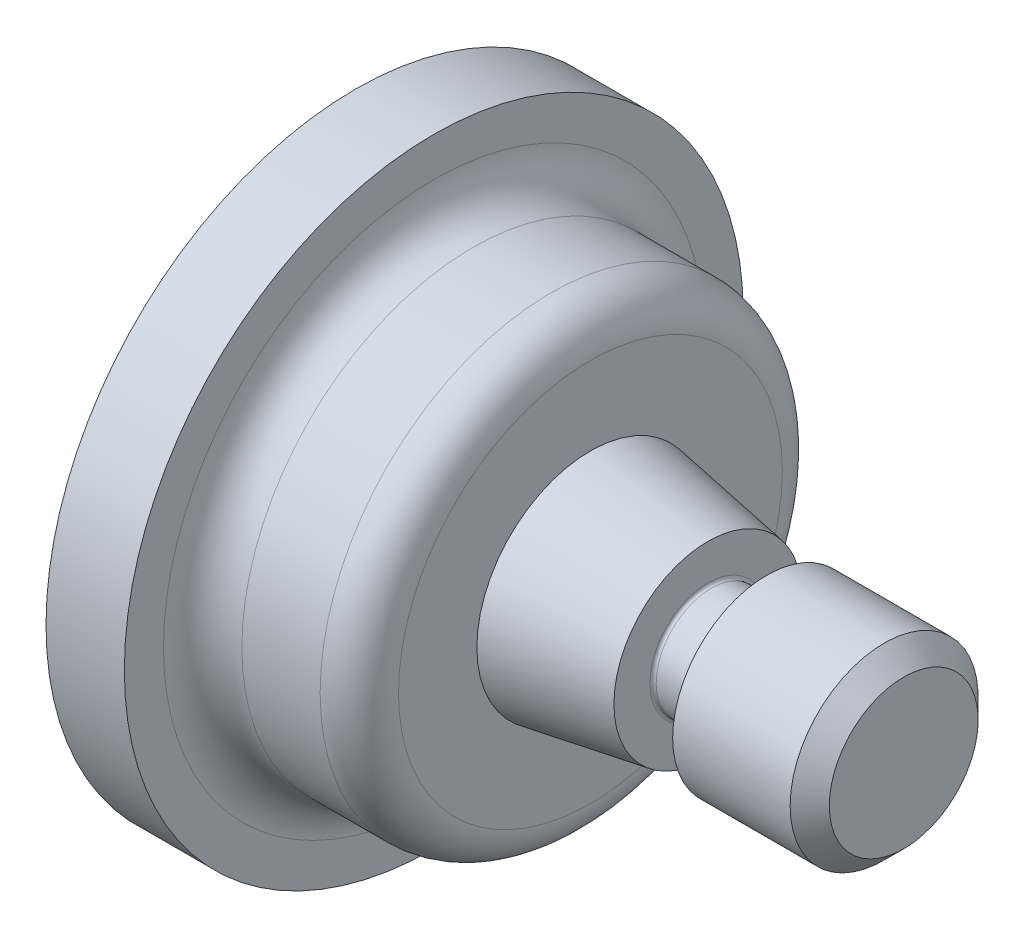
ISO-10303-21;
HEADER;
FILE_DESCRIPTION(('STEP AP214'),'2;1');
FILE_NAME('part.step','',(''),(''),'','','');
FILE_SCHEMA(('AUTOMOTIVE_DESIGN { 1 0 10303 214 1 1 1 1 }'));
ENDSEC;
DATA;
#1=APPLICATION_CONTEXT('core data for automotive mechanical design processes');
#2=APPLICATION_PROTOCOL_DEFINITION('international standard','automotive_design',2000,#1);
#3=PRODUCT_CONTEXT('',#1,'mechanical');
#4=PRODUCT('Part','Part','',(#3));
#5=PRODUCT_RELATED_PRODUCT_CATEGORY('part','',(#4));
#6=PRODUCT_DEFINITION_FORMATION('','',#4);
#7=PRODUCT_DEFINITION_CONTEXT('part definition',#1,'design');
#8=PRODUCT_DEFINITION('design','',#6,#7);
#9=PRODUCT_DEFINITION_SHAPE('','',#8);
#10=(LENGTH_UNIT() NAMED_UNIT(*) SI_UNIT(.MILLI.,.METRE.));
#11=(NAMED_UNIT(*) PLANE_ANGLE_UNIT() SI_UNIT($,.RADIAN.));
#12=(NAMED_UNIT(*) SI_UNIT($,.STERADIAN.) SOLID_ANGLE_UNIT());
#13=UNCERTAINTY_MEASURE_WITH_UNIT(LENGTH_MEASURE(1.E-05),#10,'distance_accuracy_value','');
#14=(GEOMETRIC_REPRESENTATION_CONTEXT(3) GLOBAL_UNCERTAINTY_ASSIGNED_CONTEXT((#13)) GLOBAL_UNIT_ASSIGNED_CONTEXT((#10,
#11,#12)) REPRESENTATION_CONTEXT('',''));
#15=CARTESIAN_POINT('',(0.,0.,0.));
#16=DIRECTION('',(0.,0.,1.));
#17=DIRECTION('',(1.,0.,0.));
#18=AXIS2_PLACEMENT_3D('',#15,#16,#17);
#19=CARTESIAN_POINT('',(-88.8999841855403,50.165,0.));
#20=DIRECTION('',(1.,0.,0.));
#21=DIRECTION('',(0.,0.,-1.));
#22=AXIS2_PLACEMENT_3D('',#19,#20,#21);
#23=PLANE('',#22);
#24=CARTESIAN_POINT('',(-88.8999841855403,0.,0.));
#25=DIRECTION('',(-1.,0.,0.));
#26=DIRECTION('',(0.,0.,1.));
#27=AXIS2_PLACEMENT_3D('',#24,#25,#26);
#28=CIRCLE('',#27,50.165);
#29=CARTESIAN_POINT('',(-88.8999841855403,0.,50.165));
#30=VERTEX_POINT('',#29);
#31=EDGE_CURVE('E83',#30,#30,#28,.T.);
#32=ORIENTED_EDGE('',*,*,#31,.T.);
#33=EDGE_LOOP('',(#32));
#34=FACE_BOUND('',#33,.T.);
#35=ADVANCED_FACE('F34',(#34),#23,.F.);
#36=CARTESIAN_POINT('',(0.,0.,0.));
#37=DIRECTION('',(-1.,0.,0.));
#38=DIRECTION('',(0.,0.,1.));
#39=AXIS2_PLACEMENT_3D('',#36,#37,#38);
#40=PLANE('',#39);
#41=CARTESIAN_POINT('',(0.,0.,0.));
#42=DIRECTION('',(-1.,0.,0.));
#43=DIRECTION('',(0.,0.,1.));
#44=AXIS2_PLACEMENT_3D('',#41,#42,#43);
#45=CIRCLE('',#44,12.0649920927663);
#46=CARTESIAN_POINT('',(0.,0.,12.0649920927663));
#47=VERTEX_POINT('',#46);
#48=EDGE_CURVE('E10',#47,#47,#45,.T.);
#49=ORIENTED_EDGE('',*,*,#48,.F.);
#50=EDGE_LOOP('',(#49));
#51=FACE_BOUND('',#50,.T.);
#52=ADVANCED_FACE('F167',(#51),#40,.F.);
#53=CARTESIAN_POINT('',(0.,0.,0.));
#54=DIRECTION('',(-1.,0.,0.));
#55=DIRECTION('',(0.,0.,1.));
#56=AXIS2_PLACEMENT_3D('',#53,#54,#55);
#57=CONICAL_SURFACE('',#56,12.0649920927663,0.785398163397448);
#58=CARTESIAN_POINT('',(-3.17500000000012,0.,0.));
#59=DIRECTION('',(-1.,0.,0.));
#60=DIRECTION('',(0.,0.,1.));
#61=AXIS2_PLACEMENT_3D('',#58,#59,#60);
#62=CIRCLE('',#61,15.2399920927665);
#63=CARTESIAN_POINT('',(-3.17500000000012,0.,15.2399920927665));
#64=VERTEX_POINT('',#63);
#65=EDGE_CURVE('E40',#64,#64,#62,.T.);
#66=ORIENTED_EDGE('',*,*,#65,.F.);
#67=EDGE_LOOP('',(#66));
#68=FACE_BOUND('',#67,.T.);
#69=ORIENTED_EDGE('',*,*,#48,.T.);
#70=EDGE_LOOP('',(#69));
#71=FACE_BOUND('',#70,.T.);
#72=ADVANCED_FACE('F162',(#68,#71),#57,.T.);
#73=CARTESIAN_POINT('',(0.,0.,0.));
#74=DIRECTION('',(-1.,0.,0.));
#75=DIRECTION('',(0.,0.,1.));
#76=AXIS2_PLACEMENT_3D('',#73,#74,#75);
#77=CYLINDRICAL_SURFACE('',#76,15.2399920927665);
#78=CARTESIAN_POINT('',(-22.2250000000001,0.,0.));
#79=DIRECTION('',(-1.,0.,0.));
#80=DIRECTION('',(0.,0.,1.));
#81=AXIS2_PLACEMENT_3D('',#78,#79,#80);
#82=CIRCLE('',#81,15.2399920927665);
#83=CARTESIAN_POINT('',(-22.2250000000001,0.,15.2399920927665));
#84=VERTEX_POINT('',#83);
#85=EDGE_CURVE('E44',#84,#84,#82,.T.);
#86=ORIENTED_EDGE('',*,*,#85,.F.);
#87=EDGE_LOOP('',(#86));
#88=FACE_BOUND('',#87,.T.);
#89=ORIENTED_EDGE('',*,*,#65,.T.);
#90=EDGE_LOOP('',(#89));
#91=FACE_BOUND('',#90,.T.);
#92=ADVANCED_FACE('F157',(#88,#91),#77,.T.);
#93=CARTESIAN_POINT('',(-22.2250000000001,15.2399920927665,0.));
#94=DIRECTION('',(1.,0.,0.));
#95=DIRECTION('',(0.,0.,-1.));
#96=AXIS2_PLACEMENT_3D('',#93,#94,#95);
#97=PLANE('',#96);
#98=CARTESIAN_POINT('',(-22.2250000000001,0.,0.));
#99=DIRECTION('',(-1.,0.,0.));
#100=DIRECTION('',(0.,0.,1.));
#101=AXIS2_PLACEMENT_3D('',#98,#99,#100);
#102=CIRCLE('',#101,9.39799209276645);
#103=CARTESIAN_POINT('',(-22.2250000000001,0.,9.39799209276645));
#104=VERTEX_POINT('',#103);
#105=EDGE_CURVE('E48',#104,#104,#102,.T.);
#106=ORIENTED_EDGE('',*,*,#105,.F.);
#107=EDGE_LOOP('',(#106));
#108=FACE_BOUND('',#107,.T.);
#109=ORIENTED_EDGE('',*,*,#85,.T.);
#110=EDGE_LOOP('',(#109));
#111=FACE_BOUND('',#110,.T.);
#112=ADVANCED_FACE('F151',(#108,#111),#97,.F.);
#113=CARTESIAN_POINT('',(-22.7330000000001,0.,0.));
#114=DIRECTION('',(-1.,0.,0.));
#115=DIRECTION('',(0.,0.,1.));
#116=AXIS2_PLACEMENT_3D('',#113,#114,#115);
#117=TOROIDAL_SURFACE('',#116,9.39799209276645,0.508000000000002);
#118=CARTESIAN_POINT('',(-22.7330000000001,0.,0.));
#119=DIRECTION('',(-1.,0.,0.));
#120=DIRECTION('',(0.,0.,1.));
#121=AXIS2_PLACEMENT_3D('',#118,#119,#120);
#122=CIRCLE('',#121,8.88999209276645);
#123=CARTESIAN_POINT('',(-22.7330000000001,0.,8.88999209276645));
#124=VERTEX_POINT('',#123);
#125=EDGE_CURVE('E53',#124,#124,#122,.T.);
#126=ORIENTED_EDGE('',*,*,#125,.F.);
#127=EDGE_LOOP('',(#126));
#128=FACE_BOUND('',#127,.T.);
#129=ORIENTED_EDGE('',*,*,#105,.T.);
#130=EDGE_LOOP('',(#129));
#131=FACE_BOUND('',#130,.T.);
#132=ADVANCED_FACE('F145',(#128,#131),#117,.F.);
#133=CARTESIAN_POINT('',(0.,0.,0.));
#134=DIRECTION('',(-1.,0.,0.));
#135=DIRECTION('',(0.,0.,1.));
#136=AXIS2_PLACEMENT_3D('',#133,#134,#135);
#137=CYLINDRICAL_SURFACE('',#136,8.88999209276645);
#138=CARTESIAN_POINT('',(-31.2420000000001,0.,0.));
#139=DIRECTION('',(-1.,0.,0.));
#140=DIRECTION('',(0.,0.,1.));
#141=AXIS2_PLACEMENT_3D('',#138,#139,#140);
#142=CIRCLE('',#141,8.88999209276646);
#143=CARTESIAN_POINT('',(-31.2420000000001,0.,8.88999209276646));
#144=VERTEX_POINT('',#143);
#145=EDGE_CURVE('E56',#144,#144,#142,.T.);
#146=ORIENTED_EDGE('',*,*,#145,.F.);
#147=EDGE_LOOP('',(#146));
#148=FACE_BOUND('',#147,.T.);
#149=ORIENTED_EDGE('',*,*,#125,.T.);
#150=EDGE_LOOP('',(#149));
#151=FACE_BOUND('',#150,.T.);
#152=ADVANCED_FACE('F139',(#148,#151),#137,.T.);
#153=CARTESIAN_POINT('',(-31.2420000000001,0.,0.));
#154=DIRECTION('',(-1.,0.,0.));
#155=DIRECTION('',(0.,0.,1.));
#156=AXIS2_PLACEMENT_3D('',#153,#154,#155);
#157=TOROIDAL_SURFACE('',#156,9.39799209276645,0.508);
#158=CARTESIAN_POINT('',(-31.7500000000001,0.,0.));
#159=DIRECTION('',(-1.,0.,0.));
#160=DIRECTION('',(0.,0.,1.));
#161=AXIS2_PLACEMENT_3D('',#158,#159,#160);
#162=CIRCLE('',#161,9.39799209276645);
#163=CARTESIAN_POINT('',(-31.7500000000001,0.,9.39799209276645));
#164=VERTEX_POINT('',#163);
#165=EDGE_CURVE('E59',#164,#164,#162,.T.);
#166=ORIENTED_EDGE('',*,*,#165,.F.);
#167=EDGE_LOOP('',(#166));
#168=FACE_BOUND('',#167,.T.);
#169=ORIENTED_EDGE('',*,*,#145,.T.);
#170=EDGE_LOOP('',(#169));
#171=FACE_BOUND('',#170,.T.);
#172=ADVANCED_FACE('F133',(#168,#171),#157,.F.);
#173=CARTESIAN_POINT('',(-31.7500000000001,15.2399920927665,0.));
#174=DIRECTION('',(-1.,0.,0.));
#175=DIRECTION('',(0.,0.,1.));
#176=AXIS2_PLACEMENT_3D('',#173,#174,#175);
#177=PLANE('',#176);
#178=CARTESIAN_POINT('',(-31.7500000000001,0.,0.));
#179=DIRECTION('',(-1.,0.,0.));
#180=DIRECTION('',(0.,0.,1.));
#181=AXIS2_PLACEMENT_3D('',#178,#179,#180);
#182=CIRCLE('',#181,15.2399920927665);
#183=CARTESIAN_POINT('',(-31.7500000000001,0.,15.2399920927665));
#184=VERTEX_POINT('',#183);
#185=EDGE_CURVE('E62',#184,#184,#182,.T.);
#186=ORIENTED_EDGE('',*,*,#185,.F.);
#187=EDGE_LOOP('',(#186));
#188=FACE_BOUND('',#187,.T.);
#189=ORIENTED_EDGE('',*,*,#165,.T.);
#190=EDGE_LOOP('',(#189));
#191=FACE_BOUND('',#190,.T.);
#192=ADVANCED_FACE('F127',(#188,#191),#177,.F.);
#193=CARTESIAN_POINT('',(-31.7500000000001,0.,0.));
#194=DIRECTION('',(-1.,0.,0.));
#195=DIRECTION('',(0.,0.,1.));
#196=AXIS2_PLACEMENT_3D('',#193,#194,#195);
#197=CONICAL_SURFACE('',#196,15.2399920927665,0.165148677414627);
#198=CARTESIAN_POINT('',(-50.7987547671477,0.,0.));
#199=DIRECTION('',(-1.,0.,0.));
#200=DIRECTION('',(0.,0.,1.));
#201=AXIS2_PLACEMENT_3D('',#198,#199,#200);
#202=CIRCLE('',#201,18.4147845539577);
#203=CARTESIAN_POINT('',(-50.7987547671477,0.,18.4147845539577));
#204=VERTEX_POINT('',#203);
#205=EDGE_CURVE('E65',#204,#204,#202,.T.);
#206=ORIENTED_EDGE('',*,*,#205,.F.);
#207=EDGE_LOOP('',(#206));
#208=FACE_BOUND('',#207,.T.);
#209=ORIENTED_EDGE('',*,*,#185,.T.);
#210=EDGE_LOOP('',(#209));
#211=FACE_BOUND('',#210,.T.);
#212=ADVANCED_FACE('F121',(#208,#211),#197,.T.);
#213=CARTESIAN_POINT('',(-50.7987547671477,31.1149920927665,0.));
#214=DIRECTION('',(-1.,0.,0.));
#215=DIRECTION('',(0.,0.,1.));
#216=AXIS2_PLACEMENT_3D('',#213,#214,#215);
#217=PLANE('',#216);
#218=CARTESIAN_POINT('',(-50.7987547671477,0.,0.));
#219=DIRECTION('',(-1.,0.,0.));
#220=DIRECTION('',(0.,0.,1.));
#221=AXIS2_PLACEMENT_3D('',#218,#219,#220);
#222=CIRCLE('',#221,31.1149920927665);
#223=CARTESIAN_POINT('',(-50.7987547671477,0.,31.1149920927665));
#224=VERTEX_POINT('',#223);
#225=EDGE_CURVE('E68',#224,#224,#222,.T.);
#226=ORIENTED_EDGE('',*,*,#225,.F.);
#227=EDGE_LOOP('',(#226));
#228=FACE_BOUND('',#227,.T.);
#229=ORIENTED_EDGE('',*,*,#205,.T.);
#230=EDGE_LOOP('',(#229));
#231=FACE_BOUND('',#230,.T.);
#232=ADVANCED_FACE('F115',(#228,#231),#217,.F.);
#233=CARTESIAN_POINT('',(-57.1500000000001,0.,0.));
#234=DIRECTION('',(-1.,0.,0.));
#235=DIRECTION('',(0.,0.,1.));
#236=AXIS2_PLACEMENT_3D('',#233,#234,#235);
#237=TOROIDAL_SURFACE('',#236,31.1149920927665,6.3512452328524);
#238=CARTESIAN_POINT('',(-57.1500000000001,0.,0.));
#239=DIRECTION('',(-1.,0.,0.));
#240=DIRECTION('',(0.,0.,1.));
#241=AXIS2_PLACEMENT_3D('',#238,#239,#240);
#242=CIRCLE('',#241,37.4662373256189);
#243=CARTESIAN_POINT('',(-57.1500000000001,0.,37.4662373256189));
#244=VERTEX_POINT('',#243);
#245=EDGE_CURVE('E71',#244,#244,#242,.T.);
#246=ORIENTED_EDGE('',*,*,#245,.F.);
#247=EDGE_LOOP('',(#246));
#248=FACE_BOUND('',#247,.T.);
#249=ORIENTED_EDGE('',*,*,#225,.T.);
#250=EDGE_LOOP('',(#249));
#251=FACE_BOUND('',#250,.T.);
#252=ADVANCED_FACE('F109',(#248,#251),#237,.T.);
#253=CARTESIAN_POINT('',(0.,0.,0.));
#254=DIRECTION('',(-1.,0.,0.));
#255=DIRECTION('',(0.,0.,1.));
#256=AXIS2_PLACEMENT_3D('',#253,#254,#255);
#257=CYLINDRICAL_SURFACE('',#256,37.4662373256189);
#258=CARTESIAN_POINT('',(-69.8499762783067,0.,0.));
#259=DIRECTION('',(-1.,0.,0.));
#260=DIRECTION('',(0.,0.,1.));
#261=AXIS2_PLACEMENT_3D('',#258,#259,#260);
#262=CIRCLE('',#261,37.4662373256189);
#263=CARTESIAN_POINT('',(-69.8499762783067,0.,37.4662373256189));
#264=VERTEX_POINT('',#263);
#265=EDGE_CURVE('E74',#264,#264,#262,.T.);
#266=ORIENTED_EDGE('',*,*,#265,.F.);
#267=EDGE_LOOP('',(#266));
#268=FACE_BOUND('',#267,.T.);
#269=ORIENTED_EDGE('',*,*,#245,.T.);
#270=EDGE_LOOP('',(#269));
#271=FACE_BOUND('',#270,.T.);
#272=ADVANCED_FACE('F103',(#268,#271),#257,.T.);
#273=CARTESIAN_POINT('',(-69.8499762783067,0.,0.));
#274=DIRECTION('',(-1.,0.,0.));
#275=DIRECTION('',(0.,0.,1.));
#276=AXIS2_PLACEMENT_3D('',#273,#274,#275);
#277=TOROIDAL_SURFACE('',#276,43.815,6.34876267438113);
#278=CARTESIAN_POINT('',(-76.1987389526878,0.,0.));
#279=DIRECTION('',(-1.,0.,0.));
#280=DIRECTION('',(0.,0.,1.));
#281=AXIS2_PLACEMENT_3D('',#278,#279,#280);
#282=CIRCLE('',#281,43.815);
#283=CARTESIAN_POINT('',(-76.1987389526878,0.,43.815));
#284=VERTEX_POINT('',#283);
#285=EDGE_CURVE('E77',#284,#284,#282,.T.);
#286=ORIENTED_EDGE('',*,*,#285,.F.);
#287=EDGE_LOOP('',(#286));
#288=FACE_BOUND('',#287,.T.);
#289=ORIENTED_EDGE('',*,*,#265,.T.);
#290=EDGE_LOOP('',(#289));
#291=FACE_BOUND('',#290,.T.);
#292=ADVANCED_FACE('F97',(#288,#291),#277,.F.);
#293=CARTESIAN_POINT('',(-76.1987389526878,50.165,0.));
#294=DIRECTION('',(-1.,0.,0.));
#295=DIRECTION('',(0.,0.,1.));
#296=AXIS2_PLACEMENT_3D('',#293,#294,#295);
#297=PLANE('',#296);
#298=CARTESIAN_POINT('',(-76.1987389526878,0.,0.));
#299=DIRECTION('',(-1.,0.,0.));
#300=DIRECTION('',(0.,0.,1.));
#301=AXIS2_PLACEMENT_3D('',#298,#299,#300);
#302=CIRCLE('',#301,50.165);
#303=CARTESIAN_POINT('',(-76.1987389526878,0.,50.165));
#304=VERTEX_POINT('',#303);
#305=EDGE_CURVE('E80',#304,#304,#302,.T.);
#306=ORIENTED_EDGE('',*,*,#305,.F.);
#307=EDGE_LOOP('',(#306));
#308=FACE_BOUND('',#307,.T.);
#309=ORIENTED_EDGE('',*,*,#285,.T.);
#310=EDGE_LOOP('',(#309));
#311=FACE_BOUND('',#310,.T.);
#312=ADVANCED_FACE('F91',(#308,#311),#297,.F.);
#313=CARTESIAN_POINT('',(0.,0.,0.));
#314=DIRECTION('',(-1.,0.,0.));
#315=DIRECTION('',(0.,0.,1.));
#316=AXIS2_PLACEMENT_3D('',#313,#314,#315);
#317=CYLINDRICAL_SURFACE('',#316,50.165);
#318=ORIENTED_EDGE('',*,*,#31,.F.);
#319=EDGE_LOOP('',(#318));
#320=FACE_BOUND('',#319,.T.);
#321=ORIENTED_EDGE('',*,*,#305,.T.);
#322=EDGE_LOOP('',(#321));
#323=FACE_BOUND('',#322,.T.);
#324=ADVANCED_FACE('F88',(#320,#323),#317,.T.);
#325=CLOSED_SHELL('',(#35,#52,#72,#92,#112,#132,#152,#172,#192,#212,#232,#252,#272,#292,#312,#324));
#326=MANIFOLD_SOLID_BREP('B2',#325);
#327=ADVANCED_BREP_SHAPE_REPRESENTATION('',(#18,#326),#14);
#328=SHAPE_DEFINITION_REPRESENTATION(#9,#327);
ENDSEC;
END-ISO-10303-21;
